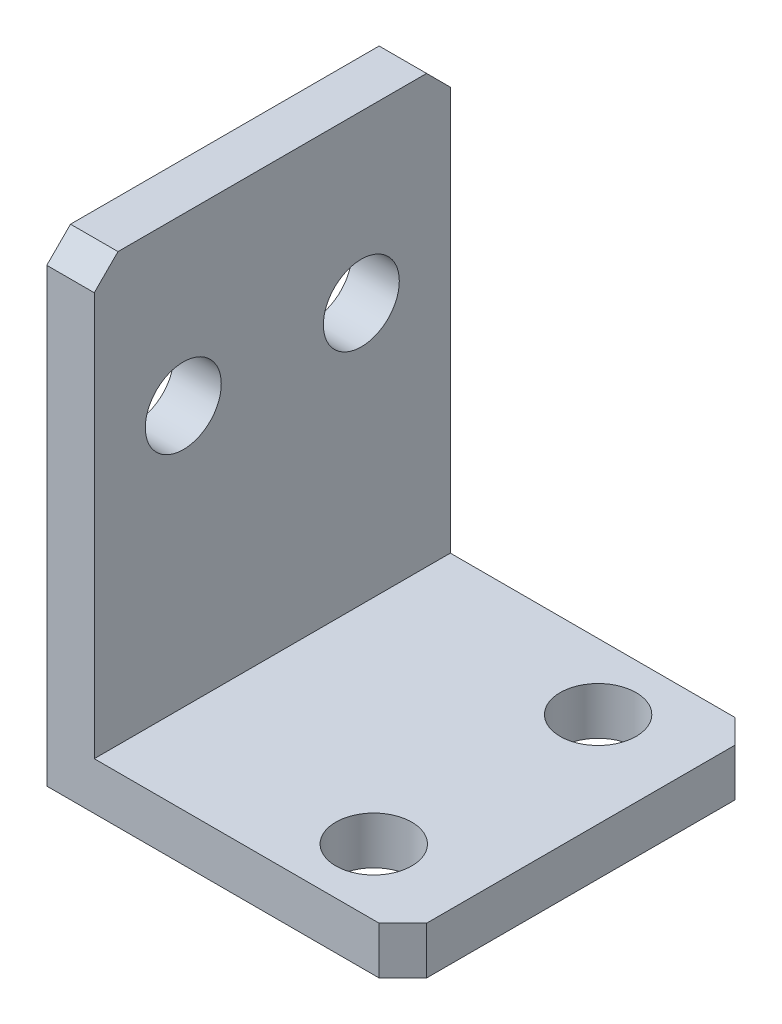
ISO-10303-21;
HEADER;
FILE_DESCRIPTION(('STEP AP214'),'2;1');
FILE_NAME('part.step','',(''),(''),'','','');
FILE_SCHEMA(('AUTOMOTIVE_DESIGN { 1 0 10303 214 1 1 1 1 }'));
ENDSEC;
DATA;
#1=APPLICATION_CONTEXT('core data for automotive mechanical design processes');
#2=APPLICATION_PROTOCOL_DEFINITION('international standard','automotive_design',2000,#1);
#3=PRODUCT_CONTEXT('',#1,'mechanical');
#4=PRODUCT('Part','Part','',(#3));
#5=PRODUCT_RELATED_PRODUCT_CATEGORY('part','',(#4));
#6=PRODUCT_DEFINITION_FORMATION('','',#4);
#7=PRODUCT_DEFINITION_CONTEXT('part definition',#1,'design');
#8=PRODUCT_DEFINITION('design','',#6,#7);
#9=PRODUCT_DEFINITION_SHAPE('','',#8);
#10=(LENGTH_UNIT() NAMED_UNIT(*) SI_UNIT(.MILLI.,.METRE.));
#11=(NAMED_UNIT(*) PLANE_ANGLE_UNIT() SI_UNIT($,.RADIAN.));
#12=(NAMED_UNIT(*) SI_UNIT($,.STERADIAN.) SOLID_ANGLE_UNIT());
#13=UNCERTAINTY_MEASURE_WITH_UNIT(LENGTH_MEASURE(1.E-05),#10,'distance_accuracy_value','');
#14=(GEOMETRIC_REPRESENTATION_CONTEXT(3) GLOBAL_UNCERTAINTY_ASSIGNED_CONTEXT((#13)) GLOBAL_UNIT_ASSIGNED_CONTEXT((#10,
#11,#12)) REPRESENTATION_CONTEXT('',''));
#15=CARTESIAN_POINT('',(0.,0.,0.));
#16=DIRECTION('',(0.,0.,1.));
#17=DIRECTION('',(1.,0.,0.));
#18=AXIS2_PLACEMENT_3D('',#15,#16,#17);
#19=CARTESIAN_POINT('',(15.,0.,15.));
#20=DIRECTION('',(0.,1.,0.));
#21=DIRECTION('',(-1.,0.,0.));
#22=AXIS2_PLACEMENT_3D('',#19,#20,#21);
#23=PLANE('',#22);
#24=CARTESIAN_POINT('',(11.,0.,2.775));
#25=DIRECTION('',(0.,1.,0.));
#26=DIRECTION('',(0.,0.,1.));
#27=AXIS2_PLACEMENT_3D('',#24,#25,#26);
#28=CIRCLE('',#27,1.6);
#29=CARTESIAN_POINT('',(11.,0.,4.375));
#30=VERTEX_POINT('',#29);
#31=EDGE_CURVE('E227',#30,#30,#28,.T.);
#32=ORIENTED_EDGE('',*,*,#31,.T.);
#33=EDGE_LOOP('',(#32));
#34=FACE_BOUND('',#33,.T.);
#35=CARTESIAN_POINT('',(11.,0.,12.225));
#36=DIRECTION('',(0.,1.,0.));
#37=DIRECTION('',(0.,0.,1.));
#38=AXIS2_PLACEMENT_3D('',#35,#36,#37);
#39=CIRCLE('',#38,1.6);
#40=CARTESIAN_POINT('',(11.,0.,13.825));
#41=VERTEX_POINT('',#40);
#42=EDGE_CURVE('E160',#41,#41,#39,.T.);
#43=ORIENTED_EDGE('',*,*,#42,.T.);
#44=EDGE_LOOP('',(#43));
#45=FACE_BOUND('',#44,.T.);
#46=DIRECTION('',(1.,0.,0.));
#47=VECTOR('',#46,1.);
#48=CARTESIAN_POINT('',(15.,0.,0.));
#49=LINE('',#48,#47);
#50=CARTESIAN_POINT('',(0.,0.,0.));
#51=VERTEX_POINT('',#50);
#52=CARTESIAN_POINT('',(14.,0.,0.));
#53=VERTEX_POINT('',#52);
#54=EDGE_CURVE('E157',#51,#53,#49,.T.);
#55=ORIENTED_EDGE('',*,*,#54,.T.);
#56=DIRECTION('',(0.707106781186549,0.,0.707106781186546));
#57=VECTOR('',#56,1.);
#58=CARTESIAN_POINT('',(15.,0.,0.999999999999997));
#59=LINE('',#58,#57);
#60=CARTESIAN_POINT('',(15.,0.,0.999999999999997));
#61=VERTEX_POINT('',#60);
#62=EDGE_CURVE('E191',#53,#61,#59,.T.);
#63=ORIENTED_EDGE('',*,*,#62,.T.);
#64=DIRECTION('',(0.,0.,-1.));
#65=VECTOR('',#64,1.);
#66=CARTESIAN_POINT('',(15.,0.,15.));
#67=LINE('',#66,#65);
#68=CARTESIAN_POINT('',(15.,0.,14.));
#69=VERTEX_POINT('',#68);
#70=EDGE_CURVE('E173',#69,#61,#67,.T.);
#71=ORIENTED_EDGE('',*,*,#70,.F.);
#72=DIRECTION('',(0.707106781186545,0.,-0.70710678118655));
#73=VECTOR('',#72,1.);
#74=CARTESIAN_POINT('',(14.,0.,15.));
#75=LINE('',#74,#73);
#76=CARTESIAN_POINT('',(14.,0.,15.));
#77=VERTEX_POINT('',#76);
#78=EDGE_CURVE('E189',#69,#77,#75,.F.);
#79=ORIENTED_EDGE('',*,*,#78,.T.);
#80=DIRECTION('',(1.,0.,0.));
#81=VECTOR('',#80,1.);
#82=CARTESIAN_POINT('',(15.,0.,15.));
#83=LINE('',#82,#81);
#84=CARTESIAN_POINT('',(0.,0.,15.));
#85=VERTEX_POINT('',#84);
#86=EDGE_CURVE('E137',#85,#77,#83,.T.);
#87=ORIENTED_EDGE('',*,*,#86,.F.);
#88=DIRECTION('',(0.,0.,-1.));
#89=VECTOR('',#88,1.);
#90=CARTESIAN_POINT('',(0.,0.,15.));
#91=LINE('',#90,#89);
#92=EDGE_CURVE('E153',#85,#51,#91,.T.);
#93=ORIENTED_EDGE('',*,*,#92,.T.);
#94=EDGE_LOOP('',(#55,#63,#71,#79,#87,#93));
#95=FACE_BOUND('',#94,.T.);
#96=ADVANCED_FACE('F48',(#34,#45,#95),#23,.F.);
#97=CARTESIAN_POINT('',(15.,2.,15.));
#98=DIRECTION('',(-1.,0.,0.));
#99=DIRECTION('',(0.,0.,1.));
#100=AXIS2_PLACEMENT_3D('',#97,#98,#99);
#101=PLANE('',#100);
#102=ORIENTED_EDGE('',*,*,#70,.T.);
#103=DIRECTION('',(0.,1.,0.));
#104=VECTOR('',#103,1.);
#105=CARTESIAN_POINT('',(15.,2.,0.999999999999997));
#106=LINE('',#105,#104);
#107=CARTESIAN_POINT('',(15.,2.,0.999999999999997));
#108=VERTEX_POINT('',#107);
#109=EDGE_CURVE('E178',#61,#108,#106,.T.);
#110=ORIENTED_EDGE('',*,*,#109,.T.);
#111=DIRECTION('',(0.,0.,-1.));
#112=VECTOR('',#111,1.);
#113=CARTESIAN_POINT('',(15.,2.,15.));
#114=LINE('',#113,#112);
#115=CARTESIAN_POINT('',(15.,2.,14.));
#116=VERTEX_POINT('',#115);
#117=EDGE_CURVE('E146',#116,#108,#114,.T.);
#118=ORIENTED_EDGE('',*,*,#117,.F.);
#119=DIRECTION('',(0.,-1.,0.));
#120=VECTOR('',#119,1.);
#121=CARTESIAN_POINT('',(15.,2.,14.));
#122=LINE('',#121,#120);
#123=EDGE_CURVE('E176',#116,#69,#122,.T.);
#124=ORIENTED_EDGE('',*,*,#123,.T.);
#125=EDGE_LOOP('',(#102,#110,#118,#124));
#126=FACE_BOUND('',#125,.T.);
#127=ADVANCED_FACE('F269',(#126),#101,.F.);
#128=CARTESIAN_POINT('',(2.,2.,15.));
#129=DIRECTION('',(0.,-1.,0.));
#130=DIRECTION('',(1.,0.,0.));
#131=AXIS2_PLACEMENT_3D('',#128,#129,#130);
#132=PLANE('',#131);
#133=CARTESIAN_POINT('',(11.,2.,2.775));
#134=DIRECTION('',(0.,1.,0.));
#135=DIRECTION('',(0.,0.,1.));
#136=AXIS2_PLACEMENT_3D('',#133,#134,#135);
#137=CIRCLE('',#136,1.6);
#138=CARTESIAN_POINT('',(11.,2.,4.375));
#139=VERTEX_POINT('',#138);
#140=EDGE_CURVE('E230',#139,#139,#137,.T.);
#141=ORIENTED_EDGE('',*,*,#140,.F.);
#142=EDGE_LOOP('',(#141));
#143=FACE_BOUND('',#142,.T.);
#144=CARTESIAN_POINT('',(11.,2.,12.225));
#145=DIRECTION('',(0.,1.,0.));
#146=DIRECTION('',(0.,0.,1.));
#147=AXIS2_PLACEMENT_3D('',#144,#145,#146);
#148=CIRCLE('',#147,1.6);
#149=CARTESIAN_POINT('',(11.,2.,13.825));
#150=VERTEX_POINT('',#149);
#151=EDGE_CURVE('E224',#150,#150,#148,.T.);
#152=ORIENTED_EDGE('',*,*,#151,.F.);
#153=EDGE_LOOP('',(#152));
#154=FACE_BOUND('',#153,.T.);
#155=ORIENTED_EDGE('',*,*,#117,.T.);
#156=DIRECTION('',(-0.707106781186549,0.,-0.707106781186546));
#157=VECTOR('',#156,1.);
#158=CARTESIAN_POINT('',(15.,2.,0.999999999999997));
#159=LINE('',#158,#157);
#160=CARTESIAN_POINT('',(14.,2.,0.));
#161=VERTEX_POINT('',#160);
#162=EDGE_CURVE('E183',#108,#161,#159,.T.);
#163=ORIENTED_EDGE('',*,*,#162,.T.);
#164=DIRECTION('',(-1.,0.,0.));
#165=VECTOR('',#164,1.);
#166=CARTESIAN_POINT('',(2.,2.,0.));
#167=LINE('',#166,#165);
#168=CARTESIAN_POINT('',(2.,2.,0.));
#169=VERTEX_POINT('',#168);
#170=EDGE_CURVE('E144',#161,#169,#167,.T.);
#171=ORIENTED_EDGE('',*,*,#170,.T.);
#172=DIRECTION('',(0.,0.,-1.));
#173=VECTOR('',#172,1.);
#174=CARTESIAN_POINT('',(2.,2.,15.));
#175=LINE('',#174,#173);
#176=CARTESIAN_POINT('',(2.,2.,15.));
#177=VERTEX_POINT('',#176);
#178=EDGE_CURVE('E140',#177,#169,#175,.T.);
#179=ORIENTED_EDGE('',*,*,#178,.F.);
#180=DIRECTION('',(-1.,0.,0.));
#181=VECTOR('',#180,1.);
#182=CARTESIAN_POINT('',(2.,2.,15.));
#183=LINE('',#182,#181);
#184=CARTESIAN_POINT('',(14.,2.,15.));
#185=VERTEX_POINT('',#184);
#186=EDGE_CURVE('E126',#185,#177,#183,.T.);
#187=ORIENTED_EDGE('',*,*,#186,.F.);
#188=DIRECTION('',(-0.707106781186545,0.,0.70710678118655));
#189=VECTOR('',#188,1.);
#190=CARTESIAN_POINT('',(14.,2.,15.));
#191=LINE('',#190,#189);
#192=EDGE_CURVE('E181',#185,#116,#191,.F.);
#193=ORIENTED_EDGE('',*,*,#192,.T.);
#194=EDGE_LOOP('',(#155,#163,#171,#179,#187,#193));
#195=FACE_BOUND('',#194,.T.);
#196=ADVANCED_FACE('F142',(#143,#154,#195),#132,.F.);
#197=CARTESIAN_POINT('',(2.,20.,15.));
#198=DIRECTION('',(-1.,0.,0.));
#199=DIRECTION('',(0.,-1.,0.));
#200=AXIS2_PLACEMENT_3D('',#197,#198,#199);
#201=PLANE('',#200);
#202=CARTESIAN_POINT('',(2.,13.,11.25));
#203=DIRECTION('',(1.,0.,0.));
#204=DIRECTION('',(0.,0.,-1.));
#205=AXIS2_PLACEMENT_3D('',#202,#203,#204);
#206=CIRCLE('',#205,1.59999999999999);
#207=CARTESIAN_POINT('',(2.,13.,9.65000000000001));
#208=VERTEX_POINT('',#207);
#209=EDGE_CURVE('E242',#208,#208,#206,.T.);
#210=ORIENTED_EDGE('',*,*,#209,.F.);
#211=EDGE_LOOP('',(#210));
#212=FACE_BOUND('',#211,.T.);
#213=CARTESIAN_POINT('',(2.,13.,3.75));
#214=DIRECTION('',(1.,0.,0.));
#215=DIRECTION('',(0.,0.,-1.));
#216=AXIS2_PLACEMENT_3D('',#213,#214,#215);
#217=CIRCLE('',#216,1.59999999999999);
#218=CARTESIAN_POINT('',(2.,13.,2.15000000000001));
#219=VERTEX_POINT('',#218);
#220=EDGE_CURVE('E236',#219,#219,#217,.T.);
#221=ORIENTED_EDGE('',*,*,#220,.F.);
#222=EDGE_LOOP('',(#221));
#223=FACE_BOUND('',#222,.T.);
#224=DIRECTION('',(0.,1.,0.));
#225=VECTOR('',#224,1.);
#226=CARTESIAN_POINT('',(2.,20.,0.));
#227=LINE('',#226,#225);
#228=CARTESIAN_POINT('',(2.,19.,0.));
#229=VERTEX_POINT('',#228);
#230=EDGE_CURVE('E162',#169,#229,#227,.T.);
#231=ORIENTED_EDGE('',*,*,#230,.T.);
#232=DIRECTION('',(0.,0.707106781186549,0.707106781186546));
#233=VECTOR('',#232,1.);
#234=CARTESIAN_POINT('',(2.,20.,0.999999999999998));
#235=LINE('',#234,#233);
#236=CARTESIAN_POINT('',(2.,20.,0.999999999999997));
#237=VERTEX_POINT('',#236);
#238=EDGE_CURVE('E13',#229,#237,#235,.T.);
#239=ORIENTED_EDGE('',*,*,#238,.T.);
#240=DIRECTION('',(0.,0.,-1.));
#241=VECTOR('',#240,1.);
#242=CARTESIAN_POINT('',(2.,20.,15.));
#243=LINE('',#242,#241);
#244=CARTESIAN_POINT('',(2.,20.,14.));
#245=VERTEX_POINT('',#244);
#246=EDGE_CURVE('E147',#245,#237,#243,.T.);
#247=ORIENTED_EDGE('',*,*,#246,.F.);
#248=DIRECTION('',(0.,0.707106781186546,-0.707106781186549));
#249=VECTOR('',#248,1.);
#250=CARTESIAN_POINT('',(2.,19.,15.));
#251=LINE('',#250,#249);
#252=CARTESIAN_POINT('',(2.,19.,15.));
#253=VERTEX_POINT('',#252);
#254=EDGE_CURVE('E56',#245,#253,#251,.F.);
#255=ORIENTED_EDGE('',*,*,#254,.T.);
#256=DIRECTION('',(0.,1.,0.));
#257=VECTOR('',#256,1.);
#258=CARTESIAN_POINT('',(2.,20.,15.));
#259=LINE('',#258,#257);
#260=EDGE_CURVE('E132',#177,#253,#259,.T.);
#261=ORIENTED_EDGE('',*,*,#260,.F.);
#262=ORIENTED_EDGE('',*,*,#178,.T.);
#263=EDGE_LOOP('',(#231,#239,#247,#255,#261,#262));
#264=FACE_BOUND('',#263,.T.);
#265=ADVANCED_FACE('F149',(#212,#223,#264),#201,.F.);
#266=CARTESIAN_POINT('',(0.,20.,15.));
#267=DIRECTION('',(0.,-1.,0.));
#268=DIRECTION('',(0.,0.,-1.));
#269=AXIS2_PLACEMENT_3D('',#266,#267,#268);
#270=PLANE('',#269);
#271=ORIENTED_EDGE('',*,*,#246,.T.);
#272=DIRECTION('',(-1.,0.,0.));
#273=VECTOR('',#272,1.);
#274=CARTESIAN_POINT('',(0.,20.,0.999999999999997));
#275=LINE('',#274,#273);
#276=CARTESIAN_POINT('',(0.,20.,0.999999999999997));
#277=VERTEX_POINT('',#276);
#278=EDGE_CURVE('E197',#237,#277,#275,.T.);
#279=ORIENTED_EDGE('',*,*,#278,.T.);
#280=DIRECTION('',(0.,0.,-1.));
#281=VECTOR('',#280,1.);
#282=CARTESIAN_POINT('',(0.,20.,15.));
#283=LINE('',#282,#281);
#284=CARTESIAN_POINT('',(0.,20.,14.));
#285=VERTEX_POINT('',#284);
#286=EDGE_CURVE('E168',#285,#277,#283,.T.);
#287=ORIENTED_EDGE('',*,*,#286,.F.);
#288=DIRECTION('',(1.,0.,0.));
#289=VECTOR('',#288,1.);
#290=CARTESIAN_POINT('',(0.,20.,14.));
#291=LINE('',#290,#289);
#292=EDGE_CURVE('E68',#285,#245,#291,.T.);
#293=ORIENTED_EDGE('',*,*,#292,.T.);
#294=EDGE_LOOP('',(#271,#279,#287,#293));
#295=FACE_BOUND('',#294,.T.);
#296=ADVANCED_FACE('F214',(#295),#270,.F.);
#297=CARTESIAN_POINT('',(0.,0.,15.));
#298=DIRECTION('',(1.,0.,0.));
#299=DIRECTION('',(0.,0.,-1.));
#300=AXIS2_PLACEMENT_3D('',#297,#298,#299);
#301=PLANE('',#300);
#302=CARTESIAN_POINT('',(0.,13.,11.25));
#303=DIRECTION('',(1.,0.,0.));
#304=DIRECTION('',(0.,0.,-1.));
#305=AXIS2_PLACEMENT_3D('',#302,#303,#304);
#306=CIRCLE('',#305,1.6);
#307=CARTESIAN_POINT('',(0.,13.,9.65));
#308=VERTEX_POINT('',#307);
#309=EDGE_CURVE('E239',#308,#308,#306,.T.);
#310=ORIENTED_EDGE('',*,*,#309,.T.);
#311=EDGE_LOOP('',(#310));
#312=FACE_BOUND('',#311,.T.);
#313=CARTESIAN_POINT('',(0.,13.,3.75));
#314=DIRECTION('',(1.,0.,0.));
#315=DIRECTION('',(0.,0.,-1.));
#316=AXIS2_PLACEMENT_3D('',#313,#314,#315);
#317=CIRCLE('',#316,1.6);
#318=CARTESIAN_POINT('',(0.,13.,2.15));
#319=VERTEX_POINT('',#318);
#320=EDGE_CURVE('E233',#319,#319,#317,.T.);
#321=ORIENTED_EDGE('',*,*,#320,.T.);
#322=EDGE_LOOP('',(#321));
#323=FACE_BOUND('',#322,.T.);
#324=ORIENTED_EDGE('',*,*,#286,.T.);
#325=DIRECTION('',(0.,-0.707106781186549,-0.707106781186546));
#326=VECTOR('',#325,1.);
#327=CARTESIAN_POINT('',(0.,20.,0.999999999999997));
#328=LINE('',#327,#326);
#329=CARTESIAN_POINT('',(0.,19.,0.));
#330=VERTEX_POINT('',#329);
#331=EDGE_CURVE('E202',#277,#330,#328,.T.);
#332=ORIENTED_EDGE('',*,*,#331,.T.);
#333=DIRECTION('',(0.,-1.,0.));
#334=VECTOR('',#333,1.);
#335=CARTESIAN_POINT('',(0.,0.,0.));
#336=LINE('',#335,#334);
#337=EDGE_CURVE('E164',#330,#51,#336,.T.);
#338=ORIENTED_EDGE('',*,*,#337,.T.);
#339=ORIENTED_EDGE('',*,*,#92,.F.);
#340=DIRECTION('',(0.,-1.,0.));
#341=VECTOR('',#340,1.);
#342=CARTESIAN_POINT('',(0.,0.,15.));
#343=LINE('',#342,#341);
#344=CARTESIAN_POINT('',(0.,19.,15.));
#345=VERTEX_POINT('',#344);
#346=EDGE_CURVE('E151',#345,#85,#343,.T.);
#347=ORIENTED_EDGE('',*,*,#346,.F.);
#348=DIRECTION('',(0.,-0.707106781186546,0.707106781186549));
#349=VECTOR('',#348,1.);
#350=CARTESIAN_POINT('',(0.,19.,15.));
#351=LINE('',#350,#349);
#352=EDGE_CURVE('E200',#345,#285,#351,.F.);
#353=ORIENTED_EDGE('',*,*,#352,.T.);
#354=EDGE_LOOP('',(#324,#332,#338,#339,#347,#353));
#355=FACE_BOUND('',#354,.T.);
#356=ADVANCED_FACE('F205',(#312,#323,#355),#301,.F.);
#357=CARTESIAN_POINT('',(0.,0.,15.));
#358=DIRECTION('',(0.,0.,-1.));
#359=DIRECTION('',(-1.,0.,0.));
#360=AXIS2_PLACEMENT_3D('',#357,#358,#359);
#361=PLANE('',#360);
#362=ORIENTED_EDGE('',*,*,#86,.T.);
#363=DIRECTION('',(0.,1.,0.));
#364=VECTOR('',#363,1.);
#365=CARTESIAN_POINT('',(14.,0.,15.));
#366=LINE('',#365,#364);
#367=EDGE_CURVE('E135',#77,#185,#366,.T.);
#368=ORIENTED_EDGE('',*,*,#367,.T.);
#369=ORIENTED_EDGE('',*,*,#186,.T.);
#370=ORIENTED_EDGE('',*,*,#260,.T.);
#371=DIRECTION('',(-1.,0.,0.));
#372=VECTOR('',#371,1.);
#373=CARTESIAN_POINT('',(0.,19.,15.));
#374=LINE('',#373,#372);
#375=EDGE_CURVE('E193',#253,#345,#374,.T.);
#376=ORIENTED_EDGE('',*,*,#375,.T.);
#377=ORIENTED_EDGE('',*,*,#346,.T.);
#378=EDGE_LOOP('',(#362,#368,#369,#370,#376,#377));
#379=FACE_BOUND('',#378,.T.);
#380=ADVANCED_FACE('F129',(#379),#361,.F.);
#381=CARTESIAN_POINT('',(0.,0.,0.));
#382=DIRECTION('',(0.,0.,-1.));
#383=DIRECTION('',(-1.,0.,0.));
#384=AXIS2_PLACEMENT_3D('',#381,#382,#383);
#385=PLANE('',#384);
#386=ORIENTED_EDGE('',*,*,#170,.F.);
#387=DIRECTION('',(0.,-1.,0.));
#388=VECTOR('',#387,1.);
#389=CARTESIAN_POINT('',(14.,0.,0.));
#390=LINE('',#389,#388);
#391=EDGE_CURVE('E187',#161,#53,#390,.T.);
#392=ORIENTED_EDGE('',*,*,#391,.T.);
#393=ORIENTED_EDGE('',*,*,#54,.F.);
#394=ORIENTED_EDGE('',*,*,#337,.F.);
#395=DIRECTION('',(1.,0.,0.));
#396=VECTOR('',#395,1.);
#397=CARTESIAN_POINT('',(2.,19.,0.));
#398=LINE('',#397,#396);
#399=EDGE_CURVE('E185',#330,#229,#398,.T.);
#400=ORIENTED_EDGE('',*,*,#399,.T.);
#401=ORIENTED_EDGE('',*,*,#230,.F.);
#402=EDGE_LOOP('',(#386,#392,#393,#394,#400,#401));
#403=FACE_BOUND('',#402,.T.);
#404=ADVANCED_FACE('F212',(#403),#385,.T.);
#405=CARTESIAN_POINT('',(15.,2.,0.999999999999997));
#406=DIRECTION('',(0.707106781186546,0.,-0.707106781186549));
#407=DIRECTION('',(0.,-1.,0.));
#408=AXIS2_PLACEMENT_3D('',#405,#406,#407);
#409=PLANE('',#408);
#410=ORIENTED_EDGE('',*,*,#62,.F.);
#411=ORIENTED_EDGE('',*,*,#391,.F.);
#412=ORIENTED_EDGE('',*,*,#162,.F.);
#413=ORIENTED_EDGE('',*,*,#109,.F.);
#414=EDGE_LOOP('',(#410,#411,#412,#413));
#415=FACE_BOUND('',#414,.T.);
#416=ADVANCED_FACE('F280',(#415),#409,.T.);
#417=CARTESIAN_POINT('',(14.,0.,15.));
#418=DIRECTION('',(-0.70710678118655,0.,-0.707106781186545));
#419=DIRECTION('',(0.,1.,0.));
#420=AXIS2_PLACEMENT_3D('',#417,#418,#419);
#421=PLANE('',#420);
#422=ORIENTED_EDGE('',*,*,#78,.F.);
#423=ORIENTED_EDGE('',*,*,#123,.F.);
#424=ORIENTED_EDGE('',*,*,#192,.F.);
#425=ORIENTED_EDGE('',*,*,#367,.F.);
#426=EDGE_LOOP('',(#422,#423,#424,#425));
#427=FACE_BOUND('',#426,.T.);
#428=ADVANCED_FACE('F283',(#427),#421,.F.);
#429=CARTESIAN_POINT('',(0.,20.,0.999999999999997));
#430=DIRECTION('',(0.,0.707106781186546,-0.707106781186549));
#431=DIRECTION('',(1.,0.,0.));
#432=AXIS2_PLACEMENT_3D('',#429,#430,#431);
#433=PLANE('',#432);
#434=ORIENTED_EDGE('',*,*,#238,.F.);
#435=ORIENTED_EDGE('',*,*,#399,.F.);
#436=ORIENTED_EDGE('',*,*,#331,.F.);
#437=ORIENTED_EDGE('',*,*,#278,.F.);
#438=EDGE_LOOP('',(#434,#435,#436,#437));
#439=FACE_BOUND('',#438,.T.);
#440=ADVANCED_FACE('F213',(#439),#433,.T.);
#441=CARTESIAN_POINT('',(0.,19.,15.));
#442=DIRECTION('',(0.,-0.707106781186549,-0.707106781186546));
#443=DIRECTION('',(-1.,0.,0.));
#444=AXIS2_PLACEMENT_3D('',#441,#442,#443);
#445=PLANE('',#444);
#446=ORIENTED_EDGE('',*,*,#254,.F.);
#447=ORIENTED_EDGE('',*,*,#292,.F.);
#448=ORIENTED_EDGE('',*,*,#352,.F.);
#449=ORIENTED_EDGE('',*,*,#375,.F.);
#450=EDGE_LOOP('',(#446,#447,#448,#449));
#451=FACE_BOUND('',#450,.T.);
#452=ADVANCED_FACE('F50',(#451),#445,.F.);
#453=CARTESIAN_POINT('',(11.,2.,12.225));
#454=DIRECTION('',(0.,1.,0.));
#455=DIRECTION('',(0.,0.,1.));
#456=AXIS2_PLACEMENT_3D('',#453,#454,#455);
#457=CYLINDRICAL_SURFACE('',#456,1.6);
#458=ORIENTED_EDGE('',*,*,#42,.F.);
#459=EDGE_LOOP('',(#458));
#460=FACE_BOUND('',#459,.T.);
#461=ORIENTED_EDGE('',*,*,#151,.T.);
#462=EDGE_LOOP('',(#461));
#463=FACE_BOUND('',#462,.T.);
#464=ADVANCED_FACE('F264',(#460,#463),#457,.F.);
#465=CARTESIAN_POINT('',(11.,2.,2.775));
#466=DIRECTION('',(0.,1.,0.));
#467=DIRECTION('',(0.,0.,1.));
#468=AXIS2_PLACEMENT_3D('',#465,#466,#467);
#469=CYLINDRICAL_SURFACE('',#468,1.6);
#470=ORIENTED_EDGE('',*,*,#31,.F.);
#471=EDGE_LOOP('',(#470));
#472=FACE_BOUND('',#471,.T.);
#473=ORIENTED_EDGE('',*,*,#140,.T.);
#474=EDGE_LOOP('',(#473));
#475=FACE_BOUND('',#474,.T.);
#476=ADVANCED_FACE('F255',(#472,#475),#469,.F.);
#477=CARTESIAN_POINT('',(2.,13.,3.75));
#478=DIRECTION('',(1.,0.,0.));
#479=DIRECTION('',(0.,0.,-1.));
#480=AXIS2_PLACEMENT_3D('',#477,#478,#479);
#481=CYLINDRICAL_SURFACE('',#480,1.59999999999999);
#482=ORIENTED_EDGE('',*,*,#320,.F.);
#483=EDGE_LOOP('',(#482));
#484=FACE_BOUND('',#483,.T.);
#485=ORIENTED_EDGE('',*,*,#220,.T.);
#486=EDGE_LOOP('',(#485));
#487=FACE_BOUND('',#486,.T.);
#488=ADVANCED_FACE('F253',(#484,#487),#481,.F.);
#489=CARTESIAN_POINT('',(2.,13.,11.25));
#490=DIRECTION('',(1.,0.,0.));
#491=DIRECTION('',(0.,0.,-1.));
#492=AXIS2_PLACEMENT_3D('',#489,#490,#491);
#493=CYLINDRICAL_SURFACE('',#492,1.59999999999999);
#494=ORIENTED_EDGE('',*,*,#309,.F.);
#495=EDGE_LOOP('',(#494));
#496=FACE_BOUND('',#495,.T.);
#497=ORIENTED_EDGE('',*,*,#209,.T.);
#498=EDGE_LOOP('',(#497));
#499=FACE_BOUND('',#498,.T.);
#500=ADVANCED_FACE('F246',(#496,#499),#493,.F.);
#501=CLOSED_SHELL('',(#96,#127,#196,#265,#296,#356,#380,#404,#416,#428,#440,#452,#464,#476,#488,#500));
#502=MANIFOLD_SOLID_BREP('B2',#501);
#503=ADVANCED_BREP_SHAPE_REPRESENTATION('',(#18,#502),#14);
#504=SHAPE_DEFINITION_REPRESENTATION(#9,#503);
ENDSEC;
END-ISO-10303-21;
